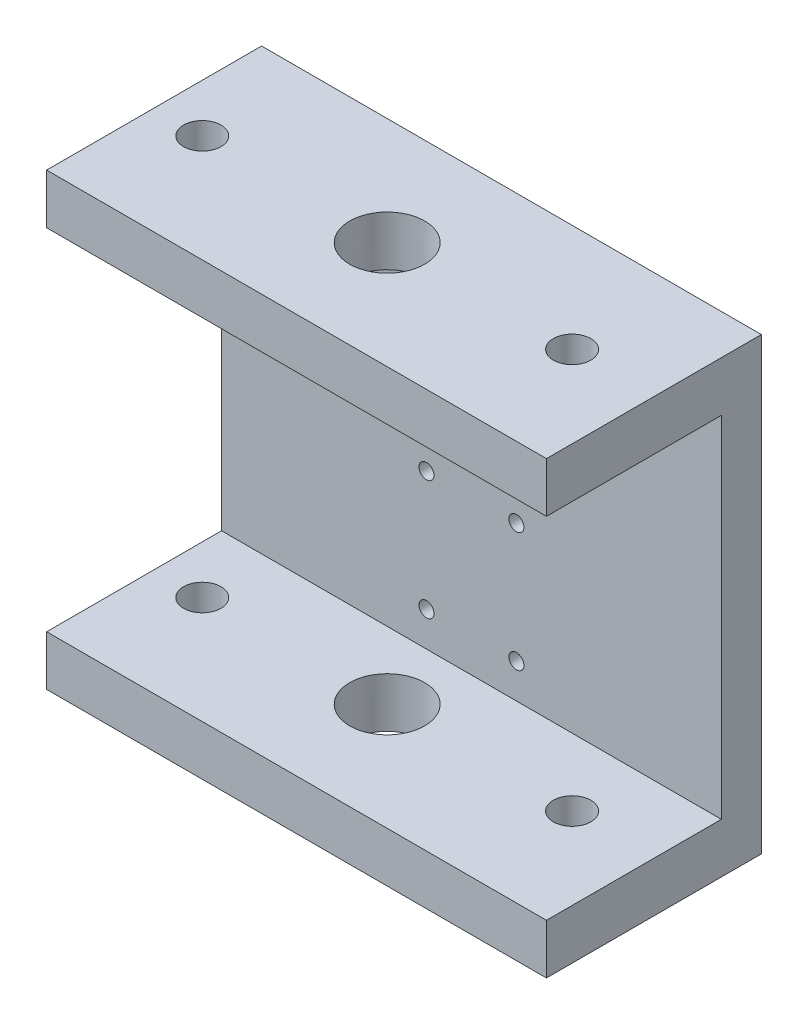
ISO-10303-21;
HEADER;
FILE_DESCRIPTION(('STEP AP214'),'2;1');
FILE_NAME('part.step','',(''),(''),'','','');
FILE_SCHEMA(('AUTOMOTIVE_DESIGN { 1 0 10303 214 1 1 1 1 }'));
ENDSEC;
DATA;
#1=APPLICATION_CONTEXT('core data for automotive mechanical design processes');
#2=APPLICATION_PROTOCOL_DEFINITION('international standard','automotive_design',2000,#1);
#3=PRODUCT_CONTEXT('',#1,'mechanical');
#4=PRODUCT('Part','Part','',(#3));
#5=PRODUCT_RELATED_PRODUCT_CATEGORY('part','',(#4));
#6=PRODUCT_DEFINITION_FORMATION('','',#4);
#7=PRODUCT_DEFINITION_CONTEXT('part definition',#1,'design');
#8=PRODUCT_DEFINITION('design','',#6,#7);
#9=PRODUCT_DEFINITION_SHAPE('','',#8);
#10=(LENGTH_UNIT() NAMED_UNIT(*) SI_UNIT(.MILLI.,.METRE.));
#11=(NAMED_UNIT(*) PLANE_ANGLE_UNIT() SI_UNIT($,.RADIAN.));
#12=(NAMED_UNIT(*) SI_UNIT($,.STERADIAN.) SOLID_ANGLE_UNIT());
#13=UNCERTAINTY_MEASURE_WITH_UNIT(LENGTH_MEASURE(1.E-05),#10,'distance_accuracy_value','');
#14=(GEOMETRIC_REPRESENTATION_CONTEXT(3) GLOBAL_UNCERTAINTY_ASSIGNED_CONTEXT((#13)) GLOBAL_UNIT_ASSIGNED_CONTEXT((#10,
#11,#12)) REPRESENTATION_CONTEXT('',''));
#15=CARTESIAN_POINT('',(0.,0.,0.));
#16=DIRECTION('',(0.,0.,1.));
#17=DIRECTION('',(1.,0.,0.));
#18=AXIS2_PLACEMENT_3D('',#15,#16,#17);
#19=CARTESIAN_POINT('',(0.,0.,8.));
#20=DIRECTION('',(0.,0.,1.));
#21=DIRECTION('',(1.,0.,0.));
#22=AXIS2_PLACEMENT_3D('',#19,#20,#21);
#23=PLANE('',#22);
#24=CARTESIAN_POINT('',(-8.99999999999984,4.16590283093793,8.));
#25=DIRECTION('',(0.,0.,1.));
#26=DIRECTION('',(1.,0.,0.));
#27=AXIS2_PLACEMENT_3D('',#24,#25,#26);
#28=CIRCLE('',#27,1.49999999992291);
#29=CARTESIAN_POINT('',(-7.50000000007694,4.16590283093793,8.));
#30=VERTEX_POINT('',#29);
#31=EDGE_CURVE('E163',#30,#30,#28,.T.);
#32=ORIENTED_EDGE('',*,*,#31,.F.);
#33=EDGE_LOOP('',(#32));
#34=FACE_BOUND('',#33,.T.);
#35=CARTESIAN_POINT('',(9.00000000000002,-28.0946310713701,8.));
#36=DIRECTION('',(0.,0.,1.));
#37=DIRECTION('',(-1.,0.,0.));
#38=AXIS2_PLACEMENT_3D('',#35,#36,#37);
#39=CIRCLE('',#38,1.50000000000001);
#40=CARTESIAN_POINT('',(7.50000000000001,-28.0946310713701,8.));
#41=VERTEX_POINT('',#40);
#42=EDGE_CURVE('E175',#41,#41,#39,.T.);
#43=ORIENTED_EDGE('',*,*,#42,.F.);
#44=EDGE_LOOP('',(#43));
#45=FACE_BOUND('',#44,.T.);
#46=CARTESIAN_POINT('',(9.00000000000002,28.0946310713702,8.));
#47=DIRECTION('',(0.,0.,1.));
#48=DIRECTION('',(1.,0.,0.));
#49=AXIS2_PLACEMENT_3D('',#46,#47,#48);
#50=CIRCLE('',#49,1.50000000000001);
#51=CARTESIAN_POINT('',(10.5,28.0946310713702,8.));
#52=VERTEX_POINT('',#51);
#53=EDGE_CURVE('E187',#52,#52,#50,.T.);
#54=ORIENTED_EDGE('',*,*,#53,.F.);
#55=EDGE_LOOP('',(#54));
#56=FACE_BOUND('',#55,.T.);
#57=CARTESIAN_POINT('',(-8.99999999999984,-28.0946310713701,8.));
#58=DIRECTION('',(0.,0.,1.));
#59=DIRECTION('',(1.,0.,0.));
#60=AXIS2_PLACEMENT_3D('',#57,#58,#59);
#61=CIRCLE('',#60,1.4999999999229);
#62=CARTESIAN_POINT('',(-7.50000000007694,-28.0946310713701,8.));
#63=VERTEX_POINT('',#62);
#64=EDGE_CURVE('E199',#63,#63,#61,.T.);
#65=ORIENTED_EDGE('',*,*,#64,.F.);
#66=EDGE_LOOP('',(#65));
#67=FACE_BOUND('',#66,.T.);
#68=CARTESIAN_POINT('',(-8.99999999999984,28.0946310713701,8.));
#69=DIRECTION('',(0.,0.,1.));
#70=DIRECTION('',(-1.,0.,0.));
#71=AXIS2_PLACEMENT_3D('',#68,#69,#70);
#72=CIRCLE('',#71,1.4999999999229);
#73=CARTESIAN_POINT('',(-10.4999999999227,28.0946310713701,8.));
#74=VERTEX_POINT('',#73);
#75=EDGE_CURVE('E193',#74,#74,#72,.T.);
#76=ORIENTED_EDGE('',*,*,#75,.F.);
#77=EDGE_LOOP('',(#76));
#78=FACE_BOUND('',#77,.T.);
#79=CARTESIAN_POINT('',(8.99999999999985,4.16590283093787,8.));
#80=DIRECTION('',(0.,0.,1.));
#81=DIRECTION('',(-1.,0.,0.));
#82=AXIS2_PLACEMENT_3D('',#79,#80,#81);
#83=CIRCLE('',#82,1.4999999999229);
#84=CARTESIAN_POINT('',(7.50000000007695,4.16590283093787,8.));
#85=VERTEX_POINT('',#84);
#86=EDGE_CURVE('E181',#85,#85,#83,.T.);
#87=ORIENTED_EDGE('',*,*,#86,.F.);
#88=EDGE_LOOP('',(#87));
#89=FACE_BOUND('',#88,.T.);
#90=CARTESIAN_POINT('',(8.99999999999985,-4.16590283093784,8.));
#91=DIRECTION('',(0.,0.,1.));
#92=DIRECTION('',(1.,0.,0.));
#93=AXIS2_PLACEMENT_3D('',#90,#91,#92);
#94=CIRCLE('',#93,1.4999999999229);
#95=CARTESIAN_POINT('',(10.4999999999228,-4.16590283093784,8.));
#96=VERTEX_POINT('',#95);
#97=EDGE_CURVE('E169',#96,#96,#94,.T.);
#98=ORIENTED_EDGE('',*,*,#97,.F.);
#99=EDGE_LOOP('',(#98));
#100=FACE_BOUND('',#99,.T.);
#101=CARTESIAN_POINT('',(-8.99999999999984,-4.1659028309379,8.));
#102=DIRECTION('',(0.,0.,1.));
#103=DIRECTION('',(-1.,0.,0.));
#104=AXIS2_PLACEMENT_3D('',#101,#102,#103);
#105=CIRCLE('',#104,1.49999999992291);
#106=CARTESIAN_POINT('',(-10.4999999999227,-4.1659028309379,8.));
#107=VERTEX_POINT('',#106);
#108=EDGE_CURVE('E157',#107,#107,#105,.T.);
#109=ORIENTED_EDGE('',*,*,#108,.F.);
#110=EDGE_LOOP('',(#109));
#111=FACE_BOUND('',#110,.T.);
#112=DIRECTION('',(0.,-1.,0.));
#113=VECTOR('',#112,1.);
#114=CARTESIAN_POINT('',(-50.,45.,8.));
#115=LINE('',#114,#113);
#116=CARTESIAN_POINT('',(-50.,35.,8.));
#117=VERTEX_POINT('',#116);
#118=CARTESIAN_POINT('',(-50.,-35.,8.));
#119=VERTEX_POINT('',#118);
#120=EDGE_CURVE('E63',#117,#119,#115,.T.);
#121=ORIENTED_EDGE('',*,*,#120,.T.);
#122=DIRECTION('',(-1.,0.,0.));
#123=VECTOR('',#122,1.);
#124=CARTESIAN_POINT('',(49.9999999999999,-35.,8.));
#125=LINE('',#124,#123);
#126=CARTESIAN_POINT('',(50.,-35.,8.));
#127=VERTEX_POINT('',#126);
#128=EDGE_CURVE('E58',#127,#119,#125,.T.);
#129=ORIENTED_EDGE('',*,*,#128,.F.);
#130=DIRECTION('',(0.,1.,0.));
#131=VECTOR('',#130,1.);
#132=CARTESIAN_POINT('',(50.,45.,8.));
#133=LINE('',#132,#131);
#134=CARTESIAN_POINT('',(50.,35.,8.));
#135=VERTEX_POINT('',#134);
#136=EDGE_CURVE('E205',#127,#135,#133,.T.);
#137=ORIENTED_EDGE('',*,*,#136,.T.);
#138=DIRECTION('',(1.,0.,0.));
#139=VECTOR('',#138,1.);
#140=CARTESIAN_POINT('',(50.,35.,8.));
#141=LINE('',#140,#139);
#142=EDGE_CURVE('E133',#117,#135,#141,.T.);
#143=ORIENTED_EDGE('',*,*,#142,.F.);
#144=EDGE_LOOP('',(#121,#129,#137,#143));
#145=FACE_BOUND('',#144,.T.);
#146=ADVANCED_FACE('F41',(#34,#45,#56,#67,#78,#89,#100,#111,#145),#23,.T.);
#147=CARTESIAN_POINT('',(0.,0.,0.));
#148=DIRECTION('',(0.,0.,1.));
#149=DIRECTION('',(1.,0.,0.));
#150=AXIS2_PLACEMENT_3D('',#147,#148,#149);
#151=PLANE('',#150);
#152=DIRECTION('',(0.,1.,0.));
#153=VECTOR('',#152,1.);
#154=CARTESIAN_POINT('',(50.,45.,0.));
#155=LINE('',#154,#153);
#156=CARTESIAN_POINT('',(50.,-45.,0.));
#157=VERTEX_POINT('',#156);
#158=CARTESIAN_POINT('',(50.,45.,0.));
#159=VERTEX_POINT('',#158);
#160=EDGE_CURVE('E202',#157,#159,#155,.T.);
#161=ORIENTED_EDGE('',*,*,#160,.F.);
#162=DIRECTION('',(1.,0.,0.));
#163=VECTOR('',#162,1.);
#164=CARTESIAN_POINT('',(-50.,-45.,0.));
#165=LINE('',#164,#163);
#166=CARTESIAN_POINT('',(-50.,-45.,0.));
#167=VERTEX_POINT('',#166);
#168=EDGE_CURVE('E207',#167,#157,#165,.T.);
#169=ORIENTED_EDGE('',*,*,#168,.F.);
#170=DIRECTION('',(0.,-1.,0.));
#171=VECTOR('',#170,1.);
#172=CARTESIAN_POINT('',(-50.,45.,0.));
#173=LINE('',#172,#171);
#174=CARTESIAN_POINT('',(-50.,45.,0.));
#175=VERTEX_POINT('',#174);
#176=EDGE_CURVE('E113',#175,#167,#173,.T.);
#177=ORIENTED_EDGE('',*,*,#176,.F.);
#178=DIRECTION('',(-1.,0.,0.));
#179=VECTOR('',#178,1.);
#180=CARTESIAN_POINT('',(-50.,45.,0.));
#181=LINE('',#180,#179);
#182=EDGE_CURVE('E211',#159,#175,#181,.T.);
#183=ORIENTED_EDGE('',*,*,#182,.F.);
#184=EDGE_LOOP('',(#161,#169,#177,#183));
#185=FACE_BOUND('',#184,.T.);
#186=CARTESIAN_POINT('',(-8.99999999999984,-28.0946310713701,0.));
#187=DIRECTION('',(0.,0.,1.));
#188=DIRECTION('',(1.,0.,0.));
#189=AXIS2_PLACEMENT_3D('',#186,#187,#188);
#190=CIRCLE('',#189,1.4999999999229);
#191=CARTESIAN_POINT('',(-7.50000000007694,-28.0946310713701,0.));
#192=VERTEX_POINT('',#191);
#193=EDGE_CURVE('E196',#192,#192,#190,.T.);
#194=ORIENTED_EDGE('',*,*,#193,.T.);
#195=EDGE_LOOP('',(#194));
#196=FACE_BOUND('',#195,.T.);
#197=CARTESIAN_POINT('',(-8.99999999999984,28.0946310713701,0.));
#198=DIRECTION('',(0.,0.,1.));
#199=DIRECTION('',(-1.,0.,0.));
#200=AXIS2_PLACEMENT_3D('',#197,#198,#199);
#201=CIRCLE('',#200,1.4999999999229);
#202=CARTESIAN_POINT('',(-10.4999999999227,28.0946310713701,0.));
#203=VERTEX_POINT('',#202);
#204=EDGE_CURVE('E190',#203,#203,#201,.T.);
#205=ORIENTED_EDGE('',*,*,#204,.T.);
#206=EDGE_LOOP('',(#205));
#207=FACE_BOUND('',#206,.T.);
#208=CARTESIAN_POINT('',(9.00000000000002,28.0946310713702,0.));
#209=DIRECTION('',(0.,0.,1.));
#210=DIRECTION('',(1.,0.,0.));
#211=AXIS2_PLACEMENT_3D('',#208,#209,#210);
#212=CIRCLE('',#211,1.50000000000001);
#213=CARTESIAN_POINT('',(10.5,28.0946310713702,0.));
#214=VERTEX_POINT('',#213);
#215=EDGE_CURVE('E184',#214,#214,#212,.T.);
#216=ORIENTED_EDGE('',*,*,#215,.T.);
#217=EDGE_LOOP('',(#216));
#218=FACE_BOUND('',#217,.T.);
#219=CARTESIAN_POINT('',(8.99999999999985,4.16590283093787,0.));
#220=DIRECTION('',(0.,0.,1.));
#221=DIRECTION('',(-1.,0.,0.));
#222=AXIS2_PLACEMENT_3D('',#219,#220,#221);
#223=CIRCLE('',#222,1.4999999999229);
#224=CARTESIAN_POINT('',(7.50000000007695,4.16590283093787,0.));
#225=VERTEX_POINT('',#224);
#226=EDGE_CURVE('E178',#225,#225,#223,.T.);
#227=ORIENTED_EDGE('',*,*,#226,.T.);
#228=EDGE_LOOP('',(#227));
#229=FACE_BOUND('',#228,.T.);
#230=CARTESIAN_POINT('',(9.00000000000002,-28.0946310713701,0.));
#231=DIRECTION('',(0.,0.,1.));
#232=DIRECTION('',(-1.,0.,0.));
#233=AXIS2_PLACEMENT_3D('',#230,#231,#232);
#234=CIRCLE('',#233,1.50000000000001);
#235=CARTESIAN_POINT('',(7.50000000000001,-28.0946310713701,0.));
#236=VERTEX_POINT('',#235);
#237=EDGE_CURVE('E172',#236,#236,#234,.T.);
#238=ORIENTED_EDGE('',*,*,#237,.T.);
#239=EDGE_LOOP('',(#238));
#240=FACE_BOUND('',#239,.T.);
#241=CARTESIAN_POINT('',(8.99999999999985,-4.16590283093784,0.));
#242=DIRECTION('',(0.,0.,1.));
#243=DIRECTION('',(1.,0.,0.));
#244=AXIS2_PLACEMENT_3D('',#241,#242,#243);
#245=CIRCLE('',#244,1.4999999999229);
#246=CARTESIAN_POINT('',(10.4999999999228,-4.16590283093784,0.));
#247=VERTEX_POINT('',#246);
#248=EDGE_CURVE('E166',#247,#247,#245,.T.);
#249=ORIENTED_EDGE('',*,*,#248,.T.);
#250=EDGE_LOOP('',(#249));
#251=FACE_BOUND('',#250,.T.);
#252=CARTESIAN_POINT('',(-8.99999999999984,4.16590283093793,0.));
#253=DIRECTION('',(0.,0.,1.));
#254=DIRECTION('',(1.,0.,0.));
#255=AXIS2_PLACEMENT_3D('',#252,#253,#254);
#256=CIRCLE('',#255,1.49999999992291);
#257=CARTESIAN_POINT('',(-7.50000000007694,4.16590283093793,0.));
#258=VERTEX_POINT('',#257);
#259=EDGE_CURVE('E160',#258,#258,#256,.T.);
#260=ORIENTED_EDGE('',*,*,#259,.T.);
#261=EDGE_LOOP('',(#260));
#262=FACE_BOUND('',#261,.T.);
#263=CARTESIAN_POINT('',(-8.99999999999984,-4.1659028309379,0.));
#264=DIRECTION('',(0.,0.,1.));
#265=DIRECTION('',(-1.,0.,0.));
#266=AXIS2_PLACEMENT_3D('',#263,#264,#265);
#267=CIRCLE('',#266,1.49999999992291);
#268=CARTESIAN_POINT('',(-10.4999999999227,-4.1659028309379,0.));
#269=VERTEX_POINT('',#268);
#270=EDGE_CURVE('E156',#269,#269,#267,.T.);
#271=ORIENTED_EDGE('',*,*,#270,.T.);
#272=EDGE_LOOP('',(#271));
#273=FACE_BOUND('',#272,.T.);
#274=ADVANCED_FACE('F267',(#185,#196,#207,#218,#229,#240,#251,#262,#273),#151,.F.);
#275=CARTESIAN_POINT('',(50.,45.,8.));
#276=DIRECTION('',(-1.,0.,0.));
#277=DIRECTION('',(0.,-1.,0.));
#278=AXIS2_PLACEMENT_3D('',#275,#276,#277);
#279=PLANE('',#278);
#280=ORIENTED_EDGE('',*,*,#160,.T.);
#281=DIRECTION('',(0.,0.,-1.));
#282=VECTOR('',#281,1.);
#283=CARTESIAN_POINT('',(50.,45.,8.));
#284=LINE('',#283,#282);
#285=CARTESIAN_POINT('',(50.,45.,43.));
#286=VERTEX_POINT('',#285);
#287=EDGE_CURVE('E11',#286,#159,#284,.T.);
#288=ORIENTED_EDGE('',*,*,#287,.F.);
#289=DIRECTION('',(0.,1.,0.));
#290=VECTOR('',#289,1.);
#291=CARTESIAN_POINT('',(50.,45.,43.));
#292=LINE('',#291,#290);
#293=CARTESIAN_POINT('',(50.,35.,43.));
#294=VERTEX_POINT('',#293);
#295=EDGE_CURVE('E145',#294,#286,#292,.T.);
#296=ORIENTED_EDGE('',*,*,#295,.F.);
#297=DIRECTION('',(0.,0.,-1.));
#298=VECTOR('',#297,1.);
#299=CARTESIAN_POINT('',(50.,35.,43.));
#300=LINE('',#299,#298);
#301=EDGE_CURVE('E148',#294,#135,#300,.T.);
#302=ORIENTED_EDGE('',*,*,#301,.T.);
#303=ORIENTED_EDGE('',*,*,#136,.F.);
#304=DIRECTION('',(0.,0.,-1.));
#305=VECTOR('',#304,1.);
#306=CARTESIAN_POINT('',(49.9999999999999,-35.,43.));
#307=LINE('',#306,#305);
#308=CARTESIAN_POINT('',(49.9999999999999,-35.,43.));
#309=VERTEX_POINT('',#308);
#310=EDGE_CURVE('E246',#309,#127,#307,.T.);
#311=ORIENTED_EDGE('',*,*,#310,.F.);
#312=DIRECTION('',(0.,1.,0.));
#313=VECTOR('',#312,1.);
#314=CARTESIAN_POINT('',(49.9999999999999,-45.,43.));
#315=LINE('',#314,#313);
#316=CARTESIAN_POINT('',(49.9999999999999,-45.,43.));
#317=VERTEX_POINT('',#316);
#318=EDGE_CURVE('E131',#317,#309,#315,.T.);
#319=ORIENTED_EDGE('',*,*,#318,.F.);
#320=DIRECTION('',(0.,0.,-1.));
#321=VECTOR('',#320,1.);
#322=CARTESIAN_POINT('',(50.,-45.,8.));
#323=LINE('',#322,#321);
#324=EDGE_CURVE('E117',#317,#157,#323,.T.);
#325=ORIENTED_EDGE('',*,*,#324,.T.);
#326=EDGE_LOOP('',(#280,#288,#296,#302,#303,#311,#319,#325));
#327=FACE_BOUND('',#326,.T.);
#328=ADVANCED_FACE('F43',(#327),#279,.F.);
#329=CARTESIAN_POINT('',(-50.,45.,8.));
#330=DIRECTION('',(0.,-1.,0.));
#331=DIRECTION('',(0.,0.,-1.));
#332=AXIS2_PLACEMENT_3D('',#329,#330,#331);
#333=PLANE('',#332);
#334=CARTESIAN_POINT('',(33.635,45.,21.5));
#335=DIRECTION('',(0.,1.,0.));
#336=DIRECTION('',(0.,0.,1.));
#337=AXIS2_PLACEMENT_3D('',#334,#335,#336);
#338=CIRCLE('',#337,3.75000000000001);
#339=CARTESIAN_POINT('',(33.635,45.,25.25));
#340=VERTEX_POINT('',#339);
#341=EDGE_CURVE('E324',#340,#340,#338,.T.);
#342=ORIENTED_EDGE('',*,*,#341,.F.);
#343=EDGE_LOOP('',(#342));
#344=FACE_BOUND('',#343,.T.);
#345=CARTESIAN_POINT('',(-40.365,45.,21.5));
#346=DIRECTION('',(0.,1.,0.));
#347=DIRECTION('',(0.,0.,1.));
#348=AXIS2_PLACEMENT_3D('',#345,#346,#347);
#349=CIRCLE('',#348,3.75);
#350=CARTESIAN_POINT('',(-40.365,45.,25.25));
#351=VERTEX_POINT('',#350);
#352=EDGE_CURVE('E328',#351,#351,#349,.T.);
#353=ORIENTED_EDGE('',*,*,#352,.F.);
#354=EDGE_LOOP('',(#353));
#355=FACE_BOUND('',#354,.T.);
#356=CARTESIAN_POINT('',(-3.36500000000001,45.,21.5));
#357=DIRECTION('',(0.,1.,0.));
#358=DIRECTION('',(0.,0.,1.));
#359=AXIS2_PLACEMENT_3D('',#356,#357,#358);
#360=CIRCLE('',#359,7.5);
#361=CARTESIAN_POINT('',(-3.36500000000001,45.,29.));
#362=VERTEX_POINT('',#361);
#363=EDGE_CURVE('E220',#362,#362,#360,.T.);
#364=ORIENTED_EDGE('',*,*,#363,.F.);
#365=EDGE_LOOP('',(#364));
#366=FACE_BOUND('',#365,.T.);
#367=ORIENTED_EDGE('',*,*,#182,.T.);
#368=DIRECTION('',(0.,0.,-1.));
#369=VECTOR('',#368,1.);
#370=CARTESIAN_POINT('',(-50.,45.,8.));
#371=LINE('',#370,#369);
#372=CARTESIAN_POINT('',(-50.,45.,43.));
#373=VERTEX_POINT('',#372);
#374=EDGE_CURVE('E50',#373,#175,#371,.T.);
#375=ORIENTED_EDGE('',*,*,#374,.F.);
#376=DIRECTION('',(-1.,0.,0.));
#377=VECTOR('',#376,1.);
#378=CARTESIAN_POINT('',(-50.,45.,43.));
#379=LINE('',#378,#377);
#380=EDGE_CURVE('E138',#286,#373,#379,.T.);
#381=ORIENTED_EDGE('',*,*,#380,.F.);
#382=ORIENTED_EDGE('',*,*,#287,.T.);
#383=EDGE_LOOP('',(#367,#375,#381,#382));
#384=FACE_BOUND('',#383,.T.);
#385=ADVANCED_FACE('F264',(#344,#355,#366,#384),#333,.F.);
#386=CARTESIAN_POINT('',(-50.,45.,8.));
#387=DIRECTION('',(1.,0.,0.));
#388=DIRECTION('',(0.,1.,0.));
#389=AXIS2_PLACEMENT_3D('',#386,#387,#388);
#390=PLANE('',#389);
#391=ORIENTED_EDGE('',*,*,#176,.T.);
#392=DIRECTION('',(0.,0.,-1.));
#393=VECTOR('',#392,1.);
#394=CARTESIAN_POINT('',(-50.,-45.,8.));
#395=LINE('',#394,#393);
#396=CARTESIAN_POINT('',(-50.,-45.,43.));
#397=VERTEX_POINT('',#396);
#398=EDGE_CURVE('E106',#397,#167,#395,.T.);
#399=ORIENTED_EDGE('',*,*,#398,.F.);
#400=DIRECTION('',(0.,-1.,0.));
#401=VECTOR('',#400,1.);
#402=CARTESIAN_POINT('',(-50.,-35.,43.));
#403=LINE('',#402,#401);
#404=CARTESIAN_POINT('',(-50.,-35.,43.));
#405=VERTEX_POINT('',#404);
#406=EDGE_CURVE('E110',#405,#397,#403,.T.);
#407=ORIENTED_EDGE('',*,*,#406,.F.);
#408=DIRECTION('',(0.,0.,-1.));
#409=VECTOR('',#408,1.);
#410=CARTESIAN_POINT('',(-50.,-35.,43.));
#411=LINE('',#410,#409);
#412=EDGE_CURVE('E126',#405,#119,#411,.T.);
#413=ORIENTED_EDGE('',*,*,#412,.T.);
#414=ORIENTED_EDGE('',*,*,#120,.F.);
#415=DIRECTION('',(0.,0.,-1.));
#416=VECTOR('',#415,1.);
#417=CARTESIAN_POINT('',(-50.,35.,43.));
#418=LINE('',#417,#416);
#419=CARTESIAN_POINT('',(-50.,35.,43.));
#420=VERTEX_POINT('',#419);
#421=EDGE_CURVE('E153',#420,#117,#418,.T.);
#422=ORIENTED_EDGE('',*,*,#421,.F.);
#423=DIRECTION('',(0.,-1.,0.));
#424=VECTOR('',#423,1.);
#425=CARTESIAN_POINT('',(-50.,35.,43.));
#426=LINE('',#425,#424);
#427=EDGE_CURVE('E141',#373,#420,#426,.T.);
#428=ORIENTED_EDGE('',*,*,#427,.F.);
#429=ORIENTED_EDGE('',*,*,#374,.T.);
#430=EDGE_LOOP('',(#391,#399,#407,#413,#414,#422,#428,#429));
#431=FACE_BOUND('',#430,.T.);
#432=ADVANCED_FACE('F108',(#431),#390,.F.);
#433=CARTESIAN_POINT('',(-50.,-45.,8.));
#434=DIRECTION('',(0.,1.,0.));
#435=DIRECTION('',(0.,0.,1.));
#436=AXIS2_PLACEMENT_3D('',#433,#434,#435);
#437=PLANE('',#436);
#438=CARTESIAN_POINT('',(33.635,-45.,21.5));
#439=DIRECTION('',(0.,1.,0.));
#440=DIRECTION('',(0.,0.,1.));
#441=AXIS2_PLACEMENT_3D('',#438,#439,#440);
#442=CIRCLE('',#441,3.75000000000001);
#443=CARTESIAN_POINT('',(33.635,-45.,25.25));
#444=VERTEX_POINT('',#443);
#445=EDGE_CURVE('E243',#444,#444,#442,.T.);
#446=ORIENTED_EDGE('',*,*,#445,.T.);
#447=EDGE_LOOP('',(#446));
#448=FACE_BOUND('',#447,.T.);
#449=CARTESIAN_POINT('',(-40.365,-45.,21.5));
#450=DIRECTION('',(0.,1.,0.));
#451=DIRECTION('',(0.,0.,1.));
#452=AXIS2_PLACEMENT_3D('',#449,#450,#451);
#453=CIRCLE('',#452,3.75);
#454=CARTESIAN_POINT('',(-40.365,-45.,25.25));
#455=VERTEX_POINT('',#454);
#456=EDGE_CURVE('E228',#455,#455,#453,.T.);
#457=ORIENTED_EDGE('',*,*,#456,.T.);
#458=EDGE_LOOP('',(#457));
#459=FACE_BOUND('',#458,.T.);
#460=CARTESIAN_POINT('',(-3.36500000000001,-45.,21.5));
#461=DIRECTION('',(0.,1.,0.));
#462=DIRECTION('',(0.,0.,1.));
#463=AXIS2_PLACEMENT_3D('',#460,#461,#462);
#464=CIRCLE('',#463,7.5);
#465=CARTESIAN_POINT('',(-3.36500000000001,-45.,29.));
#466=VERTEX_POINT('',#465);
#467=EDGE_CURVE('E224',#466,#466,#464,.T.);
#468=ORIENTED_EDGE('',*,*,#467,.T.);
#469=EDGE_LOOP('',(#468));
#470=FACE_BOUND('',#469,.T.);
#471=ORIENTED_EDGE('',*,*,#168,.T.);
#472=ORIENTED_EDGE('',*,*,#324,.F.);
#473=DIRECTION('',(1.,0.,0.));
#474=VECTOR('',#473,1.);
#475=CARTESIAN_POINT('',(-50.,-45.,43.));
#476=LINE('',#475,#474);
#477=EDGE_CURVE('E122',#397,#317,#476,.T.);
#478=ORIENTED_EDGE('',*,*,#477,.F.);
#479=ORIENTED_EDGE('',*,*,#398,.T.);
#480=EDGE_LOOP('',(#471,#472,#478,#479));
#481=FACE_BOUND('',#480,.T.);
#482=ADVANCED_FACE('F128',(#448,#459,#470,#481),#437,.F.);
#483=CARTESIAN_POINT('',(-8.99999999999984,-28.0946310713701,8.));
#484=DIRECTION('',(0.,0.,-1.));
#485=DIRECTION('',(-1.,0.,0.));
#486=AXIS2_PLACEMENT_3D('',#483,#484,#485);
#487=CYLINDRICAL_SURFACE('',#486,1.4999999999229);
#488=ORIENTED_EDGE('',*,*,#64,.T.);
#489=EDGE_LOOP('',(#488));
#490=FACE_BOUND('',#489,.T.);
#491=ORIENTED_EDGE('',*,*,#193,.F.);
#492=EDGE_LOOP('',(#491));
#493=FACE_BOUND('',#492,.T.);
#494=ADVANCED_FACE('F309',(#490,#493),#487,.F.);
#495=CARTESIAN_POINT('',(-8.99999999999984,28.0946310713701,8.));
#496=DIRECTION('',(0.,0.,-1.));
#497=DIRECTION('',(-1.,0.,0.));
#498=AXIS2_PLACEMENT_3D('',#495,#496,#497);
#499=CYLINDRICAL_SURFACE('',#498,1.4999999999229);
#500=ORIENTED_EDGE('',*,*,#75,.T.);
#501=EDGE_LOOP('',(#500));
#502=FACE_BOUND('',#501,.T.);
#503=ORIENTED_EDGE('',*,*,#204,.F.);
#504=EDGE_LOOP('',(#503));
#505=FACE_BOUND('',#504,.T.);
#506=ADVANCED_FACE('F514',(#502,#505),#499,.F.);
#507=CARTESIAN_POINT('',(9.00000000000002,28.0946310713702,8.));
#508=DIRECTION('',(0.,0.,-1.));
#509=DIRECTION('',(-1.,0.,0.));
#510=AXIS2_PLACEMENT_3D('',#507,#508,#509);
#511=CYLINDRICAL_SURFACE('',#510,1.50000000000001);
#512=ORIENTED_EDGE('',*,*,#53,.T.);
#513=EDGE_LOOP('',(#512));
#514=FACE_BOUND('',#513,.T.);
#515=ORIENTED_EDGE('',*,*,#215,.F.);
#516=EDGE_LOOP('',(#515));
#517=FACE_BOUND('',#516,.T.);
#518=ADVANCED_FACE('F504',(#514,#517),#511,.F.);
#519=CARTESIAN_POINT('',(8.99999999999985,4.16590283093787,8.));
#520=DIRECTION('',(0.,0.,-1.));
#521=DIRECTION('',(-1.,0.,0.));
#522=AXIS2_PLACEMENT_3D('',#519,#520,#521);
#523=CYLINDRICAL_SURFACE('',#522,1.4999999999229);
#524=ORIENTED_EDGE('',*,*,#86,.T.);
#525=EDGE_LOOP('',(#524));
#526=FACE_BOUND('',#525,.T.);
#527=ORIENTED_EDGE('',*,*,#226,.F.);
#528=EDGE_LOOP('',(#527));
#529=FACE_BOUND('',#528,.T.);
#530=ADVANCED_FACE('F494',(#526,#529),#523,.F.);
#531=CARTESIAN_POINT('',(9.00000000000002,-28.0946310713701,8.));
#532=DIRECTION('',(0.,0.,-1.));
#533=DIRECTION('',(-1.,0.,0.));
#534=AXIS2_PLACEMENT_3D('',#531,#532,#533);
#535=CYLINDRICAL_SURFACE('',#534,1.50000000000001);
#536=ORIENTED_EDGE('',*,*,#42,.T.);
#537=EDGE_LOOP('',(#536));
#538=FACE_BOUND('',#537,.T.);
#539=ORIENTED_EDGE('',*,*,#237,.F.);
#540=EDGE_LOOP('',(#539));
#541=FACE_BOUND('',#540,.T.);
#542=ADVANCED_FACE('F484',(#538,#541),#535,.F.);
#543=CARTESIAN_POINT('',(8.99999999999985,-4.16590283093784,8.));
#544=DIRECTION('',(0.,0.,-1.));
#545=DIRECTION('',(-1.,0.,0.));
#546=AXIS2_PLACEMENT_3D('',#543,#544,#545);
#547=CYLINDRICAL_SURFACE('',#546,1.4999999999229);
#548=ORIENTED_EDGE('',*,*,#97,.T.);
#549=EDGE_LOOP('',(#548));
#550=FACE_BOUND('',#549,.T.);
#551=ORIENTED_EDGE('',*,*,#248,.F.);
#552=EDGE_LOOP('',(#551));
#553=FACE_BOUND('',#552,.T.);
#554=ADVANCED_FACE('F298',(#550,#553),#547,.F.);
#555=CARTESIAN_POINT('',(-8.99999999999984,4.16590283093793,8.));
#556=DIRECTION('',(0.,0.,-1.));
#557=DIRECTION('',(-1.,0.,0.));
#558=AXIS2_PLACEMENT_3D('',#555,#556,#557);
#559=CYLINDRICAL_SURFACE('',#558,1.49999999992291);
#560=ORIENTED_EDGE('',*,*,#31,.T.);
#561=EDGE_LOOP('',(#560));
#562=FACE_BOUND('',#561,.T.);
#563=ORIENTED_EDGE('',*,*,#259,.F.);
#564=EDGE_LOOP('',(#563));
#565=FACE_BOUND('',#564,.T.);
#566=ADVANCED_FACE('F289',(#562,#565),#559,.F.);
#567=CARTESIAN_POINT('',(-8.99999999999984,-4.1659028309379,8.));
#568=DIRECTION('',(0.,0.,-1.));
#569=DIRECTION('',(-1.,0.,0.));
#570=AXIS2_PLACEMENT_3D('',#567,#568,#569);
#571=CYLINDRICAL_SURFACE('',#570,1.49999999992291);
#572=ORIENTED_EDGE('',*,*,#108,.T.);
#573=EDGE_LOOP('',(#572));
#574=FACE_BOUND('',#573,.T.);
#575=ORIENTED_EDGE('',*,*,#270,.F.);
#576=EDGE_LOOP('',(#575));
#577=FACE_BOUND('',#576,.T.);
#578=ADVANCED_FACE('F287',(#574,#577),#571,.F.);
#579=CARTESIAN_POINT('',(50.,35.,43.));
#580=DIRECTION('',(0.,1.,0.));
#581=DIRECTION('',(-1.,0.,0.));
#582=AXIS2_PLACEMENT_3D('',#579,#580,#581);
#583=PLANE('',#582);
#584=CARTESIAN_POINT('',(33.635,35.,21.5));
#585=DIRECTION('',(0.,1.,0.));
#586=DIRECTION('',(-1.,0.,0.));
#587=AXIS2_PLACEMENT_3D('',#584,#585,#586);
#588=CIRCLE('',#587,3.75000000000001);
#589=CARTESIAN_POINT('',(29.885,35.,21.5));
#590=VERTEX_POINT('',#589);
#591=EDGE_CURVE('E240',#590,#590,#588,.T.);
#592=ORIENTED_EDGE('',*,*,#591,.T.);
#593=EDGE_LOOP('',(#592));
#594=FACE_BOUND('',#593,.T.);
#595=CARTESIAN_POINT('',(-40.365,35.,21.5));
#596=DIRECTION('',(0.,1.,0.));
#597=DIRECTION('',(-1.,0.,0.));
#598=AXIS2_PLACEMENT_3D('',#595,#596,#597);
#599=CIRCLE('',#598,3.75);
#600=CARTESIAN_POINT('',(-44.115,35.,21.5));
#601=VERTEX_POINT('',#600);
#602=EDGE_CURVE('E223',#601,#601,#599,.T.);
#603=ORIENTED_EDGE('',*,*,#602,.T.);
#604=EDGE_LOOP('',(#603));
#605=FACE_BOUND('',#604,.T.);
#606=CARTESIAN_POINT('',(-3.36500000000001,35.,21.5));
#607=DIRECTION('',(0.,1.,0.));
#608=DIRECTION('',(-1.,0.,0.));
#609=AXIS2_PLACEMENT_3D('',#606,#607,#608);
#610=CIRCLE('',#609,7.5);
#611=CARTESIAN_POINT('',(-10.865,35.,21.5));
#612=VERTEX_POINT('',#611);
#613=EDGE_CURVE('E219',#612,#612,#610,.T.);
#614=ORIENTED_EDGE('',*,*,#613,.T.);
#615=EDGE_LOOP('',(#614));
#616=FACE_BOUND('',#615,.T.);
#617=ORIENTED_EDGE('',*,*,#142,.T.);
#618=ORIENTED_EDGE('',*,*,#301,.F.);
#619=DIRECTION('',(1.,0.,0.));
#620=VECTOR('',#619,1.);
#621=CARTESIAN_POINT('',(50.,35.,43.));
#622=LINE('',#621,#620);
#623=EDGE_CURVE('E143',#420,#294,#622,.T.);
#624=ORIENTED_EDGE('',*,*,#623,.F.);
#625=ORIENTED_EDGE('',*,*,#421,.T.);
#626=EDGE_LOOP('',(#617,#618,#624,#625));
#627=FACE_BOUND('',#626,.T.);
#628=ADVANCED_FACE('F257',(#594,#605,#616,#627),#583,.F.);
#629=CARTESIAN_POINT('',(0.,0.,43.));
#630=DIRECTION('',(0.,0.,-1.));
#631=DIRECTION('',(-1.,0.,0.));
#632=AXIS2_PLACEMENT_3D('',#629,#630,#631);
#633=PLANE('',#632);
#634=ORIENTED_EDGE('',*,*,#380,.T.);
#635=ORIENTED_EDGE('',*,*,#427,.T.);
#636=ORIENTED_EDGE('',*,*,#623,.T.);
#637=ORIENTED_EDGE('',*,*,#295,.T.);
#638=EDGE_LOOP('',(#634,#635,#636,#637));
#639=FACE_BOUND('',#638,.T.);
#640=ADVANCED_FACE('F262',(#639),#633,.F.);
#641=CARTESIAN_POINT('',(49.9999999999999,-35.,43.));
#642=DIRECTION('',(0.,-1.,0.));
#643=DIRECTION('',(1.,0.,0.));
#644=AXIS2_PLACEMENT_3D('',#641,#642,#643);
#645=PLANE('',#644);
#646=CARTESIAN_POINT('',(33.635,-35.,21.5));
#647=DIRECTION('',(0.,-1.,0.));
#648=DIRECTION('',(1.,0.,0.));
#649=AXIS2_PLACEMENT_3D('',#646,#647,#648);
#650=CIRCLE('',#649,3.75000000000001);
#651=CARTESIAN_POINT('',(37.385,-35.,21.5));
#652=VERTEX_POINT('',#651);
#653=EDGE_CURVE('E45',#652,#652,#650,.T.);
#654=ORIENTED_EDGE('',*,*,#653,.T.);
#655=EDGE_LOOP('',(#654));
#656=FACE_BOUND('',#655,.T.);
#657=CARTESIAN_POINT('',(-40.365,-35.,21.5));
#658=DIRECTION('',(0.,-1.,0.));
#659=DIRECTION('',(1.,0.,0.));
#660=AXIS2_PLACEMENT_3D('',#657,#658,#659);
#661=CIRCLE('',#660,3.75);
#662=CARTESIAN_POINT('',(-36.615,-35.,21.5));
#663=VERTEX_POINT('',#662);
#664=EDGE_CURVE('E221',#663,#663,#661,.T.);
#665=ORIENTED_EDGE('',*,*,#664,.T.);
#666=EDGE_LOOP('',(#665));
#667=FACE_BOUND('',#666,.T.);
#668=CARTESIAN_POINT('',(-3.36500000000001,-35.,21.5));
#669=DIRECTION('',(0.,-1.,0.));
#670=DIRECTION('',(1.,0.,0.));
#671=AXIS2_PLACEMENT_3D('',#668,#669,#670);
#672=CIRCLE('',#671,7.5);
#673=CARTESIAN_POINT('',(4.13499999999999,-35.,21.5));
#674=VERTEX_POINT('',#673);
#675=EDGE_CURVE('E217',#674,#674,#672,.T.);
#676=ORIENTED_EDGE('',*,*,#675,.T.);
#677=EDGE_LOOP('',(#676));
#678=FACE_BOUND('',#677,.T.);
#679=ORIENTED_EDGE('',*,*,#128,.T.);
#680=ORIENTED_EDGE('',*,*,#412,.F.);
#681=DIRECTION('',(-1.,0.,0.));
#682=VECTOR('',#681,1.);
#683=CARTESIAN_POINT('',(49.9999999999999,-35.,43.));
#684=LINE('',#683,#682);
#685=EDGE_CURVE('E124',#309,#405,#684,.T.);
#686=ORIENTED_EDGE('',*,*,#685,.F.);
#687=ORIENTED_EDGE('',*,*,#310,.T.);
#688=EDGE_LOOP('',(#679,#680,#686,#687));
#689=FACE_BOUND('',#688,.T.);
#690=ADVANCED_FACE('F251',(#656,#667,#678,#689),#645,.F.);
#691=CARTESIAN_POINT('',(0.,0.,43.));
#692=DIRECTION('',(0.,0.,1.));
#693=DIRECTION('',(1.,0.,0.));
#694=AXIS2_PLACEMENT_3D('',#691,#692,#693);
#695=PLANE('',#694);
#696=ORIENTED_EDGE('',*,*,#477,.T.);
#697=ORIENTED_EDGE('',*,*,#318,.T.);
#698=ORIENTED_EDGE('',*,*,#685,.T.);
#699=ORIENTED_EDGE('',*,*,#406,.T.);
#700=EDGE_LOOP('',(#696,#697,#698,#699));
#701=FACE_BOUND('',#700,.T.);
#702=ADVANCED_FACE('F121',(#701),#695,.T.);
#703=CARTESIAN_POINT('',(-3.36500000000001,-245.,21.5));
#704=DIRECTION('',(0.,1.,0.));
#705=DIRECTION('',(0.,0.,1.));
#706=AXIS2_PLACEMENT_3D('',#703,#704,#705);
#707=CYLINDRICAL_SURFACE('',#706,7.5);
#708=ORIENTED_EDGE('',*,*,#675,.F.);
#709=EDGE_LOOP('',(#708));
#710=FACE_BOUND('',#709,.T.);
#711=ORIENTED_EDGE('',*,*,#467,.F.);
#712=EDGE_LOOP('',(#711));
#713=FACE_BOUND('',#712,.T.);
#714=ADVANCED_FACE('F350',(#710,#713),#707,.F.);
#715=CARTESIAN_POINT('',(-40.365,-245.,21.5));
#716=DIRECTION('',(0.,1.,0.));
#717=DIRECTION('',(0.,0.,1.));
#718=AXIS2_PLACEMENT_3D('',#715,#716,#717);
#719=CYLINDRICAL_SURFACE('',#718,3.75);
#720=ORIENTED_EDGE('',*,*,#664,.F.);
#721=EDGE_LOOP('',(#720));
#722=FACE_BOUND('',#721,.T.);
#723=ORIENTED_EDGE('',*,*,#456,.F.);
#724=EDGE_LOOP('',(#723));
#725=FACE_BOUND('',#724,.T.);
#726=ADVANCED_FACE('F357',(#722,#725),#719,.F.);
#727=CARTESIAN_POINT('',(33.635,-245.,21.5));
#728=DIRECTION('',(0.,1.,0.));
#729=DIRECTION('',(0.,0.,1.));
#730=AXIS2_PLACEMENT_3D('',#727,#728,#729);
#731=CYLINDRICAL_SURFACE('',#730,3.75000000000001);
#732=ORIENTED_EDGE('',*,*,#653,.F.);
#733=EDGE_LOOP('',(#732));
#734=FACE_BOUND('',#733,.T.);
#735=ORIENTED_EDGE('',*,*,#445,.F.);
#736=EDGE_LOOP('',(#735));
#737=FACE_BOUND('',#736,.T.);
#738=ADVANCED_FACE('F340',(#734,#737),#731,.F.);
#739=ORIENTED_EDGE('',*,*,#363,.T.);
#740=EDGE_LOOP('',(#739));
#741=FACE_BOUND('',#740,.T.);
#742=ORIENTED_EDGE('',*,*,#613,.F.);
#743=EDGE_LOOP('',(#742));
#744=FACE_BOUND('',#743,.T.);
#745=ADVANCED_FACE('F347',(#741,#744),#707,.F.);
#746=ORIENTED_EDGE('',*,*,#352,.T.);
#747=EDGE_LOOP('',(#746));
#748=FACE_BOUND('',#747,.T.);
#749=ORIENTED_EDGE('',*,*,#602,.F.);
#750=EDGE_LOOP('',(#749));
#751=FACE_BOUND('',#750,.T.);
#752=ADVANCED_FACE('F338',(#748,#751),#719,.F.);
#753=ORIENTED_EDGE('',*,*,#341,.T.);
#754=EDGE_LOOP('',(#753));
#755=FACE_BOUND('',#754,.T.);
#756=ORIENTED_EDGE('',*,*,#591,.F.);
#757=EDGE_LOOP('',(#756));
#758=FACE_BOUND('',#757,.T.);
#759=ADVANCED_FACE('F335',(#755,#758),#731,.F.);
#760=CLOSED_SHELL('',(#146,#274,#328,#385,#432,#482,#494,#506,#518,#530,#542,#554,#566,#578,
#628,#640,#690,#702,#714,#726,#738,#745,#752,#759));
#761=MANIFOLD_SOLID_BREP('B2',#760);
#762=ADVANCED_BREP_SHAPE_REPRESENTATION('',(#18,#761),#14);
#763=SHAPE_DEFINITION_REPRESENTATION(#9,#762);
ENDSEC;
END-ISO-10303-21;
